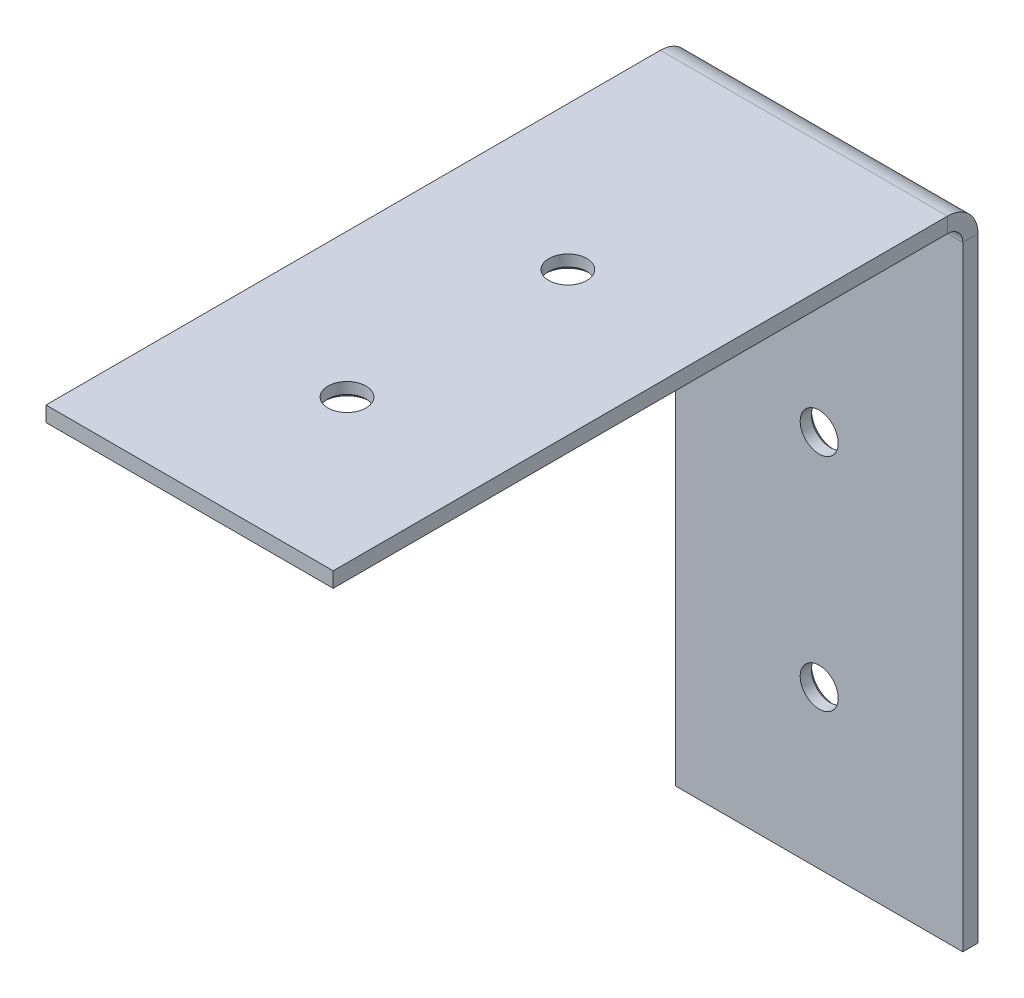
ISO-10303-21;
HEADER;
FILE_DESCRIPTION(('STEP AP214'),'2;1');
FILE_NAME('part.step','',(''),(''),'','','');
FILE_SCHEMA(('AUTOMOTIVE_DESIGN { 1 0 10303 214 1 1 1 1 }'));
ENDSEC;
DATA;
#1=APPLICATION_CONTEXT('core data for automotive mechanical design processes');
#2=APPLICATION_PROTOCOL_DEFINITION('international standard','automotive_design',2000,#1);
#3=PRODUCT_CONTEXT('',#1,'mechanical');
#4=PRODUCT('Part','Part','',(#3));
#5=PRODUCT_RELATED_PRODUCT_CATEGORY('part','',(#4));
#6=PRODUCT_DEFINITION_FORMATION('','',#4);
#7=PRODUCT_DEFINITION_CONTEXT('part definition',#1,'design');
#8=PRODUCT_DEFINITION('design','',#6,#7);
#9=PRODUCT_DEFINITION_SHAPE('','',#8);
#10=(LENGTH_UNIT() NAMED_UNIT(*) SI_UNIT(.MILLI.,.METRE.));
#11=(NAMED_UNIT(*) PLANE_ANGLE_UNIT() SI_UNIT($,.RADIAN.));
#12=(NAMED_UNIT(*) SI_UNIT($,.STERADIAN.) SOLID_ANGLE_UNIT());
#13=UNCERTAINTY_MEASURE_WITH_UNIT(LENGTH_MEASURE(1.E-05),#10,'distance_accuracy_value','');
#14=(GEOMETRIC_REPRESENTATION_CONTEXT(3) GLOBAL_UNCERTAINTY_ASSIGNED_CONTEXT((#13)) GLOBAL_UNIT_ASSIGNED_CONTEXT((#10,
#11,#12)) REPRESENTATION_CONTEXT('',''));
#15=CARTESIAN_POINT('',(0.,0.,0.));
#16=DIRECTION('',(0.,0.,1.));
#17=DIRECTION('',(1.,0.,0.));
#18=AXIS2_PLACEMENT_3D('',#15,#16,#17);
#19=CARTESIAN_POINT('',(-18.875,41.38,-2.));
#20=DIRECTION('',(-1.,0.,0.));
#21=DIRECTION('',(0.,-1.,0.));
#22=AXIS2_PLACEMENT_3D('',#19,#20,#21);
#23=PLANE('',#22);
#24=DIRECTION('',(0.,-1.,0.));
#25=VECTOR('',#24,1.);
#26=CARTESIAN_POINT('',(-18.875,41.38,0.));
#27=LINE('',#26,#25);
#28=CARTESIAN_POINT('',(-18.875,39.38,0.));
#29=VERTEX_POINT('',#28);
#30=CARTESIAN_POINT('',(-18.875,-41.38,0.));
#31=VERTEX_POINT('',#30);
#32=EDGE_CURVE('E96',#29,#31,#27,.T.);
#33=ORIENTED_EDGE('',*,*,#32,.F.);
#34=DIRECTION('',(0.,0.,-1.));
#35=VECTOR('',#34,1.);
#36=CARTESIAN_POINT('',(-18.875,39.38,0.));
#37=LINE('',#36,#35);
#38=CARTESIAN_POINT('',(-18.875,39.38,-2.));
#39=VERTEX_POINT('',#38);
#40=EDGE_CURVE('E182',#29,#39,#37,.T.);
#41=ORIENTED_EDGE('',*,*,#40,.T.);
#42=DIRECTION('',(0.,-1.,0.));
#43=VECTOR('',#42,1.);
#44=CARTESIAN_POINT('',(-18.875,41.38,-2.));
#45=LINE('',#44,#43);
#46=CARTESIAN_POINT('',(-18.875,-41.38,-2.));
#47=VERTEX_POINT('',#46);
#48=EDGE_CURVE('E102',#39,#47,#45,.T.);
#49=ORIENTED_EDGE('',*,*,#48,.T.);
#50=DIRECTION('',(0.,0.,1.));
#51=VECTOR('',#50,1.);
#52=CARTESIAN_POINT('',(-18.875,-41.38,-2.));
#53=LINE('',#52,#51);
#54=EDGE_CURVE('E58',#47,#31,#53,.T.);
#55=ORIENTED_EDGE('',*,*,#54,.T.);
#56=EDGE_LOOP('',(#33,#41,#49,#55));
#57=FACE_BOUND('',#56,.T.);
#58=ADVANCED_FACE('F49',(#57),#23,.T.);
#59=CARTESIAN_POINT('',(0.,0.,-2.));
#60=DIRECTION('',(0.,0.,1.));
#61=DIRECTION('',(1.,0.,0.));
#62=AXIS2_PLACEMENT_3D('',#59,#60,#61);
#63=PLANE('',#62);
#64=CARTESIAN_POINT('',(0.,8.34500000000004,-2.));
#65=DIRECTION('',(0.,0.,-1.));
#66=DIRECTION('',(-1.,0.,0.));
#67=AXIS2_PLACEMENT_3D('',#64,#65,#66);
#68=CIRCLE('',#67,3.025);
#69=CARTESIAN_POINT('',(-3.025,8.34500000000004,-2.));
#70=VERTEX_POINT('',#69);
#71=EDGE_CURVE('E118',#70,#70,#68,.T.);
#72=ORIENTED_EDGE('',*,*,#71,.F.);
#73=EDGE_LOOP('',(#72));
#74=FACE_BOUND('',#73,.T.);
#75=CARTESIAN_POINT('',(0.,-20.69,-2.));
#76=DIRECTION('',(0.,0.,-1.));
#77=DIRECTION('',(-1.,0.,0.));
#78=AXIS2_PLACEMENT_3D('',#75,#76,#77);
#79=CIRCLE('',#78,3.025);
#80=CARTESIAN_POINT('',(-3.02500000000001,-20.69,-2.));
#81=VERTEX_POINT('',#80);
#82=EDGE_CURVE('E114',#81,#81,#79,.T.);
#83=ORIENTED_EDGE('',*,*,#82,.F.);
#84=EDGE_LOOP('',(#83));
#85=FACE_BOUND('',#84,.T.);
#86=DIRECTION('',(-1.,0.,0.));
#87=VECTOR('',#86,1.);
#88=CARTESIAN_POINT('',(-18.875,39.38,-2.));
#89=LINE('',#88,#87);
#90=CARTESIAN_POINT('',(18.875,39.38,-2.));
#91=VERTEX_POINT('',#90);
#92=EDGE_CURVE('E175',#39,#91,#89,.F.);
#93=ORIENTED_EDGE('',*,*,#92,.T.);
#94=DIRECTION('',(0.,1.,0.));
#95=VECTOR('',#94,1.);
#96=CARTESIAN_POINT('',(18.875,41.38,-2.));
#97=LINE('',#96,#95);
#98=CARTESIAN_POINT('',(18.875,-41.38,-2.));
#99=VERTEX_POINT('',#98);
#100=EDGE_CURVE('E100',#99,#91,#97,.T.);
#101=ORIENTED_EDGE('',*,*,#100,.F.);
#102=DIRECTION('',(1.,0.,0.));
#103=VECTOR('',#102,1.);
#104=CARTESIAN_POINT('',(-18.875,-41.38,-2.));
#105=LINE('',#104,#103);
#106=EDGE_CURVE('E90',#47,#99,#105,.T.);
#107=ORIENTED_EDGE('',*,*,#106,.F.);
#108=ORIENTED_EDGE('',*,*,#48,.F.);
#109=EDGE_LOOP('',(#93,#101,#107,#108));
#110=FACE_BOUND('',#109,.T.);
#111=ADVANCED_FACE('F201',(#74,#85,#110),#63,.F.);
#112=CARTESIAN_POINT('',(0.,0.,0.));
#113=DIRECTION('',(0.,0.,1.));
#114=DIRECTION('',(1.,0.,0.));
#115=AXIS2_PLACEMENT_3D('',#112,#113,#114);
#116=PLANE('',#115);
#117=CARTESIAN_POINT('',(0.,8.34500000000004,0.));
#118=DIRECTION('',(0.,0.,1.));
#119=DIRECTION('',(1.,0.,0.));
#120=AXIS2_PLACEMENT_3D('',#117,#118,#119);
#121=CIRCLE('',#120,2.49999999999999);
#122=CARTESIAN_POINT('',(2.49999999999999,8.34500000000004,0.));
#123=VERTEX_POINT('',#122);
#124=EDGE_CURVE('E112',#123,#123,#121,.T.);
#125=ORIENTED_EDGE('',*,*,#124,.F.);
#126=EDGE_LOOP('',(#125));
#127=FACE_BOUND('',#126,.T.);
#128=CARTESIAN_POINT('',(0.,-20.69,0.));
#129=DIRECTION('',(0.,0.,1.));
#130=DIRECTION('',(1.,0.,0.));
#131=AXIS2_PLACEMENT_3D('',#128,#129,#130);
#132=CIRCLE('',#131,2.49999999999999);
#133=CARTESIAN_POINT('',(2.49999999999999,-20.69,0.));
#134=VERTEX_POINT('',#133);
#135=EDGE_CURVE('E107',#134,#134,#132,.T.);
#136=ORIENTED_EDGE('',*,*,#135,.F.);
#137=EDGE_LOOP('',(#136));
#138=FACE_BOUND('',#137,.T.);
#139=DIRECTION('',(0.,1.,0.));
#140=VECTOR('',#139,1.);
#141=CARTESIAN_POINT('',(18.875,41.38,0.));
#142=LINE('',#141,#140);
#143=CARTESIAN_POINT('',(18.875,-41.38,0.));
#144=VERTEX_POINT('',#143);
#145=CARTESIAN_POINT('',(18.875,39.38,0.));
#146=VERTEX_POINT('',#145);
#147=EDGE_CURVE('E92',#144,#146,#142,.T.);
#148=ORIENTED_EDGE('',*,*,#147,.T.);
#149=DIRECTION('',(-1.,0.,0.));
#150=VECTOR('',#149,1.);
#151=CARTESIAN_POINT('',(-18.875,39.38,0.));
#152=LINE('',#151,#150);
#153=EDGE_CURVE('E66',#29,#146,#152,.F.);
#154=ORIENTED_EDGE('',*,*,#153,.F.);
#155=ORIENTED_EDGE('',*,*,#32,.T.);
#156=DIRECTION('',(1.,0.,0.));
#157=VECTOR('',#156,1.);
#158=CARTESIAN_POINT('',(-18.875,-41.38,0.));
#159=LINE('',#158,#157);
#160=EDGE_CURVE('E88',#31,#144,#159,.T.);
#161=ORIENTED_EDGE('',*,*,#160,.T.);
#162=EDGE_LOOP('',(#148,#154,#155,#161));
#163=FACE_BOUND('',#162,.T.);
#164=ADVANCED_FACE('F98',(#127,#138,#163),#116,.T.);
#165=CARTESIAN_POINT('',(18.875,41.38,-2.));
#166=DIRECTION('',(1.,0.,0.));
#167=DIRECTION('',(0.,1.,0.));
#168=AXIS2_PLACEMENT_3D('',#165,#166,#167);
#169=PLANE('',#168);
#170=DIRECTION('',(0.,0.,-1.));
#171=VECTOR('',#170,1.);
#172=CARTESIAN_POINT('',(18.875,39.38,0.));
#173=LINE('',#172,#171);
#174=EDGE_CURVE('E95',#146,#91,#173,.T.);
#175=ORIENTED_EDGE('',*,*,#174,.F.);
#176=ORIENTED_EDGE('',*,*,#147,.F.);
#177=DIRECTION('',(0.,0.,1.));
#178=VECTOR('',#177,1.);
#179=CARTESIAN_POINT('',(18.875,-41.38,-2.));
#180=LINE('',#179,#178);
#181=EDGE_CURVE('E11',#99,#144,#180,.T.);
#182=ORIENTED_EDGE('',*,*,#181,.F.);
#183=ORIENTED_EDGE('',*,*,#100,.T.);
#184=EDGE_LOOP('',(#175,#176,#182,#183));
#185=FACE_BOUND('',#184,.T.);
#186=ADVANCED_FACE('F51',(#185),#169,.T.);
#187=CARTESIAN_POINT('',(-18.875,-41.38,-2.));
#188=DIRECTION('',(0.,-1.,0.));
#189=DIRECTION('',(0.,0.,-1.));
#190=AXIS2_PLACEMENT_3D('',#187,#188,#189);
#191=PLANE('',#190);
#192=ORIENTED_EDGE('',*,*,#160,.F.);
#193=ORIENTED_EDGE('',*,*,#54,.F.);
#194=ORIENTED_EDGE('',*,*,#106,.T.);
#195=ORIENTED_EDGE('',*,*,#181,.T.);
#196=EDGE_LOOP('',(#192,#193,#194,#195));
#197=FACE_BOUND('',#196,.T.);
#198=ADVANCED_FACE('F85',(#197),#191,.T.);
#199=CARTESIAN_POINT('',(18.875,39.38,2.));
#200=DIRECTION('',(1.,0.,0.));
#201=DIRECTION('',(0.,0.,-1.));
#202=AXIS2_PLACEMENT_3D('',#199,#200,#201);
#203=PLANE('',#202);
#204=DIRECTION('',(0.,1.,0.));
#205=VECTOR('',#204,1.);
#206=CARTESIAN_POINT('',(18.875,41.38,1.99999999999999));
#207=LINE('',#206,#205);
#208=CARTESIAN_POINT('',(18.875,41.38,1.99999999999999));
#209=VERTEX_POINT('',#208);
#210=CARTESIAN_POINT('',(18.875,43.38,1.99999999999999));
#211=VERTEX_POINT('',#210);
#212=EDGE_CURVE('E110',#209,#211,#207,.T.);
#213=ORIENTED_EDGE('',*,*,#212,.F.);
#214=CARTESIAN_POINT('',(18.875,39.38,2.));
#215=DIRECTION('',(-1.,0.,0.));
#216=DIRECTION('',(0.,0.,1.));
#217=AXIS2_PLACEMENT_3D('',#214,#215,#216);
#218=CIRCLE('',#217,2.);
#219=EDGE_CURVE('E185',#146,#209,#218,.F.);
#220=ORIENTED_EDGE('',*,*,#219,.F.);
#221=ORIENTED_EDGE('',*,*,#174,.T.);
#222=CARTESIAN_POINT('',(18.875,39.38,2.));
#223=DIRECTION('',(-1.,0.,0.));
#224=DIRECTION('',(0.,0.,1.));
#225=AXIS2_PLACEMENT_3D('',#222,#223,#224);
#226=CIRCLE('',#225,4.);
#227=EDGE_CURVE('E178',#91,#211,#226,.F.);
#228=ORIENTED_EDGE('',*,*,#227,.T.);
#229=EDGE_LOOP('',(#213,#220,#221,#228));
#230=FACE_BOUND('',#229,.T.);
#231=ADVANCED_FACE('F206',(#230),#203,.T.);
#232=CARTESIAN_POINT('',(-18.875,39.38,2.));
#233=DIRECTION('',(1.,0.,0.));
#234=DIRECTION('',(0.,0.,-1.));
#235=AXIS2_PLACEMENT_3D('',#232,#233,#234);
#236=PLANE('',#235);
#237=CARTESIAN_POINT('',(-18.875,39.38,2.));
#238=DIRECTION('',(-1.,0.,0.));
#239=DIRECTION('',(0.,0.,1.));
#240=AXIS2_PLACEMENT_3D('',#237,#238,#239);
#241=CIRCLE('',#240,2.);
#242=CARTESIAN_POINT('',(-18.875,41.38,1.99999999999999));
#243=VERTEX_POINT('',#242);
#244=EDGE_CURVE('E172',#243,#29,#241,.T.);
#245=ORIENTED_EDGE('',*,*,#244,.F.);
#246=DIRECTION('',(0.,1.,0.));
#247=VECTOR('',#246,1.);
#248=CARTESIAN_POINT('',(-18.875,41.38,1.99999999999999));
#249=LINE('',#248,#247);
#250=CARTESIAN_POINT('',(-18.875,43.38,1.99999999999999));
#251=VERTEX_POINT('',#250);
#252=EDGE_CURVE('E142',#243,#251,#249,.T.);
#253=ORIENTED_EDGE('',*,*,#252,.T.);
#254=CARTESIAN_POINT('',(-18.875,39.38,2.));
#255=DIRECTION('',(-1.,0.,0.));
#256=DIRECTION('',(0.,0.,1.));
#257=AXIS2_PLACEMENT_3D('',#254,#255,#256);
#258=CIRCLE('',#257,4.);
#259=EDGE_CURVE('E179',#251,#39,#258,.T.);
#260=ORIENTED_EDGE('',*,*,#259,.T.);
#261=ORIENTED_EDGE('',*,*,#40,.F.);
#262=EDGE_LOOP('',(#245,#253,#260,#261));
#263=FACE_BOUND('',#262,.T.);
#264=ADVANCED_FACE('F251',(#263),#236,.F.);
#265=CARTESIAN_POINT('',(-18.875,39.38,2.));
#266=DIRECTION('',(-1.,0.,0.));
#267=DIRECTION('',(0.,1.,0.));
#268=AXIS2_PLACEMENT_3D('',#265,#266,#267);
#269=CYLINDRICAL_SURFACE('',#268,4.);
#270=ORIENTED_EDGE('',*,*,#92,.F.);
#271=ORIENTED_EDGE('',*,*,#259,.F.);
#272=DIRECTION('',(-1.,0.,0.));
#273=VECTOR('',#272,1.);
#274=CARTESIAN_POINT('',(0.,43.38,1.99999999999999));
#275=LINE('',#274,#273);
#276=EDGE_CURVE('E145',#211,#251,#275,.T.);
#277=ORIENTED_EDGE('',*,*,#276,.F.);
#278=ORIENTED_EDGE('',*,*,#227,.F.);
#279=EDGE_LOOP('',(#270,#271,#277,#278));
#280=FACE_BOUND('',#279,.T.);
#281=ADVANCED_FACE('F210',(#280),#269,.T.);
#282=CARTESIAN_POINT('',(-18.875,39.38,2.));
#283=DIRECTION('',(-1.,0.,0.));
#284=DIRECTION('',(0.,1.,0.));
#285=AXIS2_PLACEMENT_3D('',#282,#283,#284);
#286=CYLINDRICAL_SURFACE('',#285,2.);
#287=ORIENTED_EDGE('',*,*,#153,.T.);
#288=ORIENTED_EDGE('',*,*,#219,.T.);
#289=DIRECTION('',(-1.,0.,0.));
#290=VECTOR('',#289,1.);
#291=CARTESIAN_POINT('',(18.875,41.38,1.99999999999999));
#292=LINE('',#291,#290);
#293=EDGE_CURVE('E139',#209,#243,#292,.T.);
#294=ORIENTED_EDGE('',*,*,#293,.T.);
#295=ORIENTED_EDGE('',*,*,#244,.T.);
#296=EDGE_LOOP('',(#287,#288,#294,#295));
#297=FACE_BOUND('',#296,.T.);
#298=ADVANCED_FACE('F247',(#297),#286,.F.);
#299=CARTESIAN_POINT('',(-18.875,43.38,0.));
#300=DIRECTION('',(-1.,0.,0.));
#301=DIRECTION('',(0.,0.,1.));
#302=AXIS2_PLACEMENT_3D('',#299,#300,#301);
#303=PLANE('',#302);
#304=DIRECTION('',(0.,0.,-1.));
#305=VECTOR('',#304,1.);
#306=CARTESIAN_POINT('',(-18.875,43.38,0.));
#307=LINE('',#306,#305);
#308=CARTESIAN_POINT('',(-18.875,43.3800000000003,82.76));
#309=VERTEX_POINT('',#308);
#310=EDGE_CURVE('E158',#309,#251,#307,.T.);
#311=ORIENTED_EDGE('',*,*,#310,.T.);
#312=ORIENTED_EDGE('',*,*,#252,.F.);
#313=DIRECTION('',(0.,0.,-1.));
#314=VECTOR('',#313,1.);
#315=CARTESIAN_POINT('',(-18.875,41.38,0.));
#316=LINE('',#315,#314);
#317=CARTESIAN_POINT('',(-18.875,41.3800000000003,82.76));
#318=VERTEX_POINT('',#317);
#319=EDGE_CURVE('E155',#318,#243,#316,.T.);
#320=ORIENTED_EDGE('',*,*,#319,.F.);
#321=DIRECTION('',(0.,-1.,0.));
#322=VECTOR('',#321,1.);
#323=CARTESIAN_POINT('',(-18.875,43.3800000000003,82.76));
#324=LINE('',#323,#322);
#325=EDGE_CURVE('E169',#309,#318,#324,.T.);
#326=ORIENTED_EDGE('',*,*,#325,.F.);
#327=EDGE_LOOP('',(#311,#312,#320,#326));
#328=FACE_BOUND('',#327,.T.);
#329=ADVANCED_FACE('F226',(#328),#303,.T.);
#330=CARTESIAN_POINT('',(18.875,43.3800000000003,82.76));
#331=DIRECTION('',(1.,0.,0.));
#332=DIRECTION('',(0.,0.,-1.));
#333=AXIS2_PLACEMENT_3D('',#330,#331,#332);
#334=PLANE('',#333);
#335=DIRECTION('',(0.,0.,1.));
#336=VECTOR('',#335,1.);
#337=CARTESIAN_POINT('',(18.875,41.3800000000003,82.76));
#338=LINE('',#337,#336);
#339=CARTESIAN_POINT('',(18.875,41.3800000000003,82.76));
#340=VERTEX_POINT('',#339);
#341=EDGE_CURVE('E150',#209,#340,#338,.T.);
#342=ORIENTED_EDGE('',*,*,#341,.F.);
#343=ORIENTED_EDGE('',*,*,#212,.T.);
#344=DIRECTION('',(0.,0.,1.));
#345=VECTOR('',#344,1.);
#346=CARTESIAN_POINT('',(18.875,43.3800000000003,82.76));
#347=LINE('',#346,#345);
#348=CARTESIAN_POINT('',(18.875,43.3800000000003,82.76));
#349=VERTEX_POINT('',#348);
#350=EDGE_CURVE('E151',#211,#349,#347,.T.);
#351=ORIENTED_EDGE('',*,*,#350,.T.);
#352=DIRECTION('',(0.,-1.,0.));
#353=VECTOR('',#352,1.);
#354=CARTESIAN_POINT('',(18.875,43.3800000000003,82.76));
#355=LINE('',#354,#353);
#356=EDGE_CURVE('E161',#349,#340,#355,.T.);
#357=ORIENTED_EDGE('',*,*,#356,.T.);
#358=EDGE_LOOP('',(#342,#343,#351,#357));
#359=FACE_BOUND('',#358,.T.);
#360=ADVANCED_FACE('F253',(#359),#334,.T.);
#361=CARTESIAN_POINT('',(0.,43.38,-1.52699734659738E-13));
#362=DIRECTION('',(0.,1.,0.));
#363=DIRECTION('',(0.,0.,1.));
#364=AXIS2_PLACEMENT_3D('',#361,#362,#363);
#365=PLANE('',#364);
#366=CARTESIAN_POINT('',(0.,43.3800000000001,33.035));
#367=DIRECTION('',(0.,1.,0.));
#368=DIRECTION('',(0.,0.,1.));
#369=AXIS2_PLACEMENT_3D('',#366,#367,#368);
#370=CIRCLE('',#369,2.49999999999999);
#371=CARTESIAN_POINT('',(0.,43.3800000000001,35.535));
#372=VERTEX_POINT('',#371);
#373=EDGE_CURVE('E53',#372,#372,#370,.T.);
#374=ORIENTED_EDGE('',*,*,#373,.F.);
#375=EDGE_LOOP('',(#374));
#376=FACE_BOUND('',#375,.T.);
#377=CARTESIAN_POINT('',(0.,43.3800000000002,62.07));
#378=DIRECTION('',(0.,1.,0.));
#379=DIRECTION('',(0.,0.,1.));
#380=AXIS2_PLACEMENT_3D('',#377,#378,#379);
#381=CIRCLE('',#380,2.49999999999999);
#382=CARTESIAN_POINT('',(0.,43.3800000000002,64.57));
#383=VERTEX_POINT('',#382);
#384=EDGE_CURVE('E116',#383,#383,#381,.T.);
#385=ORIENTED_EDGE('',*,*,#384,.F.);
#386=EDGE_LOOP('',(#385));
#387=FACE_BOUND('',#386,.T.);
#388=ORIENTED_EDGE('',*,*,#350,.F.);
#389=ORIENTED_EDGE('',*,*,#276,.T.);
#390=ORIENTED_EDGE('',*,*,#310,.F.);
#391=DIRECTION('',(-1.,0.,0.));
#392=VECTOR('',#391,1.);
#393=CARTESIAN_POINT('',(-18.875,43.3800000000003,82.76));
#394=LINE('',#393,#392);
#395=EDGE_CURVE('E154',#349,#309,#394,.T.);
#396=ORIENTED_EDGE('',*,*,#395,.F.);
#397=EDGE_LOOP('',(#388,#389,#390,#396));
#398=FACE_BOUND('',#397,.T.);
#399=ADVANCED_FACE('F218',(#376,#387,#398),#365,.T.);
#400=CARTESIAN_POINT('',(0.,41.38,-1.45716771982052E-13));
#401=DIRECTION('',(0.,1.,0.));
#402=DIRECTION('',(0.,0.,1.));
#403=AXIS2_PLACEMENT_3D('',#400,#401,#402);
#404=PLANE('',#403);
#405=CARTESIAN_POINT('',(0.,41.3800000000001,33.035));
#406=DIRECTION('',(0.,-1.,0.));
#407=DIRECTION('',(0.,0.,-1.));
#408=AXIS2_PLACEMENT_3D('',#405,#406,#407);
#409=CIRCLE('',#408,3.025);
#410=CARTESIAN_POINT('',(0.,41.3800000000001,30.01));
#411=VERTEX_POINT('',#410);
#412=EDGE_CURVE('E537',#411,#411,#409,.T.);
#413=ORIENTED_EDGE('',*,*,#412,.F.);
#414=EDGE_LOOP('',(#413));
#415=FACE_BOUND('',#414,.T.);
#416=CARTESIAN_POINT('',(0.,41.3800000000002,62.07));
#417=DIRECTION('',(0.,-1.,0.));
#418=DIRECTION('',(0.,0.,-1.));
#419=AXIS2_PLACEMENT_3D('',#416,#417,#418);
#420=CIRCLE('',#419,3.025);
#421=CARTESIAN_POINT('',(0.,41.3800000000002,59.045));
#422=VERTEX_POINT('',#421);
#423=EDGE_CURVE('E125',#422,#422,#420,.T.);
#424=ORIENTED_EDGE('',*,*,#423,.F.);
#425=EDGE_LOOP('',(#424));
#426=FACE_BOUND('',#425,.T.);
#427=ORIENTED_EDGE('',*,*,#293,.F.);
#428=ORIENTED_EDGE('',*,*,#341,.T.);
#429=DIRECTION('',(-1.,0.,0.));
#430=VECTOR('',#429,1.);
#431=CARTESIAN_POINT('',(-18.875,41.3800000000003,82.76));
#432=LINE('',#431,#430);
#433=EDGE_CURVE('E164',#340,#318,#432,.T.);
#434=ORIENTED_EDGE('',*,*,#433,.T.);
#435=ORIENTED_EDGE('',*,*,#319,.T.);
#436=EDGE_LOOP('',(#427,#428,#434,#435));
#437=FACE_BOUND('',#436,.T.);
#438=ADVANCED_FACE('F252',(#415,#426,#437),#404,.F.);
#439=CARTESIAN_POINT('',(-18.875,43.3800000000003,82.76));
#440=DIRECTION('',(0.,0.,1.));
#441=DIRECTION('',(0.,-1.,0.));
#442=AXIS2_PLACEMENT_3D('',#439,#440,#441);
#443=PLANE('',#442);
#444=ORIENTED_EDGE('',*,*,#433,.F.);
#445=ORIENTED_EDGE('',*,*,#356,.F.);
#446=ORIENTED_EDGE('',*,*,#395,.T.);
#447=ORIENTED_EDGE('',*,*,#325,.T.);
#448=EDGE_LOOP('',(#444,#445,#446,#447));
#449=FACE_BOUND('',#448,.T.);
#450=ADVANCED_FACE('F234',(#449),#443,.T.);
#451=CARTESIAN_POINT('',(0.,-20.69,-2.));
#452=DIRECTION('',(0.,0.,-1.));
#453=DIRECTION('',(-1.,0.,0.));
#454=AXIS2_PLACEMENT_3D('',#451,#452,#453);
#455=CYLINDRICAL_SURFACE('',#454,2.49999999999999);
#456=ORIENTED_EDGE('',*,*,#135,.T.);
#457=EDGE_LOOP('',(#456));
#458=FACE_BOUND('',#457,.T.);
#459=CARTESIAN_POINT('',(0.,-20.69,-1.475));
#460=DIRECTION('',(0.,0.,-1.));
#461=DIRECTION('',(-1.,0.,0.));
#462=AXIS2_PLACEMENT_3D('',#459,#460,#461);
#463=CIRCLE('',#462,2.5);
#464=CARTESIAN_POINT('',(-2.50000000000001,-20.69,-1.475));
#465=VERTEX_POINT('',#464);
#466=EDGE_CURVE('E111',#465,#465,#463,.T.);
#467=ORIENTED_EDGE('',*,*,#466,.T.);
#468=EDGE_LOOP('',(#467));
#469=FACE_BOUND('',#468,.T.);
#470=ADVANCED_FACE('F335',(#458,#469),#455,.F.);
#471=CARTESIAN_POINT('',(0.,-20.69,-2.));
#472=DIRECTION('',(0.,0.,-1.));
#473=DIRECTION('',(-1.,0.,0.));
#474=AXIS2_PLACEMENT_3D('',#471,#472,#473);
#475=CONICAL_SURFACE('',#474,3.025,0.785398163397445);
#476=ORIENTED_EDGE('',*,*,#466,.F.);
#477=EDGE_LOOP('',(#476));
#478=FACE_BOUND('',#477,.T.);
#479=ORIENTED_EDGE('',*,*,#82,.T.);
#480=EDGE_LOOP('',(#479));
#481=FACE_BOUND('',#480,.T.);
#482=ADVANCED_FACE('F346',(#478,#481),#475,.F.);
#483=CARTESIAN_POINT('',(0.,8.34500000000004,-2.));
#484=DIRECTION('',(0.,0.,-1.));
#485=DIRECTION('',(-1.,0.,0.));
#486=AXIS2_PLACEMENT_3D('',#483,#484,#485);
#487=CYLINDRICAL_SURFACE('',#486,2.49999999999999);
#488=ORIENTED_EDGE('',*,*,#124,.T.);
#489=EDGE_LOOP('',(#488));
#490=FACE_BOUND('',#489,.T.);
#491=CARTESIAN_POINT('',(0.,8.34500000000004,-1.475));
#492=DIRECTION('',(0.,0.,-1.));
#493=DIRECTION('',(-1.,0.,0.));
#494=AXIS2_PLACEMENT_3D('',#491,#492,#493);
#495=CIRCLE('',#494,2.5);
#496=CARTESIAN_POINT('',(-2.5,8.34500000000004,-1.475));
#497=VERTEX_POINT('',#496);
#498=EDGE_CURVE('E115',#497,#497,#495,.T.);
#499=ORIENTED_EDGE('',*,*,#498,.T.);
#500=EDGE_LOOP('',(#499));
#501=FACE_BOUND('',#500,.T.);
#502=ADVANCED_FACE('F358',(#490,#501),#487,.F.);
#503=CARTESIAN_POINT('',(0.,8.34500000000004,-2.));
#504=DIRECTION('',(0.,0.,-1.));
#505=DIRECTION('',(-1.,0.,0.));
#506=AXIS2_PLACEMENT_3D('',#503,#504,#505);
#507=CONICAL_SURFACE('',#506,3.025,0.785398163397445);
#508=ORIENTED_EDGE('',*,*,#498,.F.);
#509=EDGE_LOOP('',(#508));
#510=FACE_BOUND('',#509,.T.);
#511=ORIENTED_EDGE('',*,*,#71,.T.);
#512=EDGE_LOOP('',(#511));
#513=FACE_BOUND('',#512,.T.);
#514=ADVANCED_FACE('F369',(#510,#513),#507,.F.);
#515=CARTESIAN_POINT('',(0.,41.3800000000002,62.07));
#516=DIRECTION('',(0.,-1.,0.));
#517=DIRECTION('',(0.,0.,-1.));
#518=AXIS2_PLACEMENT_3D('',#515,#516,#517);
#519=CYLINDRICAL_SURFACE('',#518,2.49999999999999);
#520=ORIENTED_EDGE('',*,*,#384,.T.);
#521=EDGE_LOOP('',(#520));
#522=FACE_BOUND('',#521,.T.);
#523=CARTESIAN_POINT('',(0.,41.9050000000002,62.07));
#524=DIRECTION('',(0.,-1.,0.));
#525=DIRECTION('',(0.,0.,-1.));
#526=AXIS2_PLACEMENT_3D('',#523,#524,#525);
#527=CIRCLE('',#526,2.5);
#528=CARTESIAN_POINT('',(0.,41.9050000000002,59.57));
#529=VERTEX_POINT('',#528);
#530=EDGE_CURVE('E119',#529,#529,#527,.T.);
#531=ORIENTED_EDGE('',*,*,#530,.T.);
#532=EDGE_LOOP('',(#531));
#533=FACE_BOUND('',#532,.T.);
#534=ADVANCED_FACE('F380',(#522,#533),#519,.F.);
#535=CARTESIAN_POINT('',(0.,41.3800000000002,62.07));
#536=DIRECTION('',(0.,-1.,0.));
#537=DIRECTION('',(0.,0.,-1.));
#538=AXIS2_PLACEMENT_3D('',#535,#536,#537);
#539=CONICAL_SURFACE('',#538,3.025,0.785398163397445);
#540=ORIENTED_EDGE('',*,*,#530,.F.);
#541=EDGE_LOOP('',(#540));
#542=FACE_BOUND('',#541,.T.);
#543=ORIENTED_EDGE('',*,*,#423,.T.);
#544=EDGE_LOOP('',(#543));
#545=FACE_BOUND('',#544,.T.);
#546=ADVANCED_FACE('F390',(#542,#545),#539,.F.);
#547=CARTESIAN_POINT('',(0.,41.3800000000001,33.035));
#548=DIRECTION('',(0.,-1.,0.));
#549=DIRECTION('',(0.,0.,-1.));
#550=AXIS2_PLACEMENT_3D('',#547,#548,#549);
#551=CYLINDRICAL_SURFACE('',#550,2.49999999999999);
#552=ORIENTED_EDGE('',*,*,#373,.T.);
#553=EDGE_LOOP('',(#552));
#554=FACE_BOUND('',#553,.T.);
#555=CARTESIAN_POINT('',(0.,41.9050000000001,33.035));
#556=DIRECTION('',(0.,-1.,0.));
#557=DIRECTION('',(0.,0.,-1.));
#558=AXIS2_PLACEMENT_3D('',#555,#556,#557);
#559=CIRCLE('',#558,2.5);
#560=CARTESIAN_POINT('',(0.,41.9050000000001,30.535));
#561=VERTEX_POINT('',#560);
#562=EDGE_CURVE('E534',#561,#561,#559,.T.);
#563=ORIENTED_EDGE('',*,*,#562,.T.);
#564=EDGE_LOOP('',(#563));
#565=FACE_BOUND('',#564,.T.);
#566=ADVANCED_FACE('F401',(#554,#565),#551,.F.);
#567=CARTESIAN_POINT('',(0.,41.3800000000001,33.035));
#568=DIRECTION('',(0.,-1.,0.));
#569=DIRECTION('',(0.,0.,-1.));
#570=AXIS2_PLACEMENT_3D('',#567,#568,#569);
#571=CONICAL_SURFACE('',#570,3.025,0.785398163397445);
#572=ORIENTED_EDGE('',*,*,#562,.F.);
#573=EDGE_LOOP('',(#572));
#574=FACE_BOUND('',#573,.T.);
#575=ORIENTED_EDGE('',*,*,#412,.T.);
#576=EDGE_LOOP('',(#575));
#577=FACE_BOUND('',#576,.T.);
#578=ADVANCED_FACE('F412',(#574,#577),#571,.F.);
#579=CLOSED_SHELL('',(#58,#111,#164,#186,#198,#231,#264,#281,#298,#329,#360,#399,#438,#450,#470,
#482,#502,#514,#534,#546,#566,#578));
#580=MANIFOLD_SOLID_BREP('B2',#579);
#581=ADVANCED_BREP_SHAPE_REPRESENTATION('',(#18,#580),#14);
#582=SHAPE_DEFINITION_REPRESENTATION(#9,#581);
ENDSEC;
END-ISO-10303-21;
